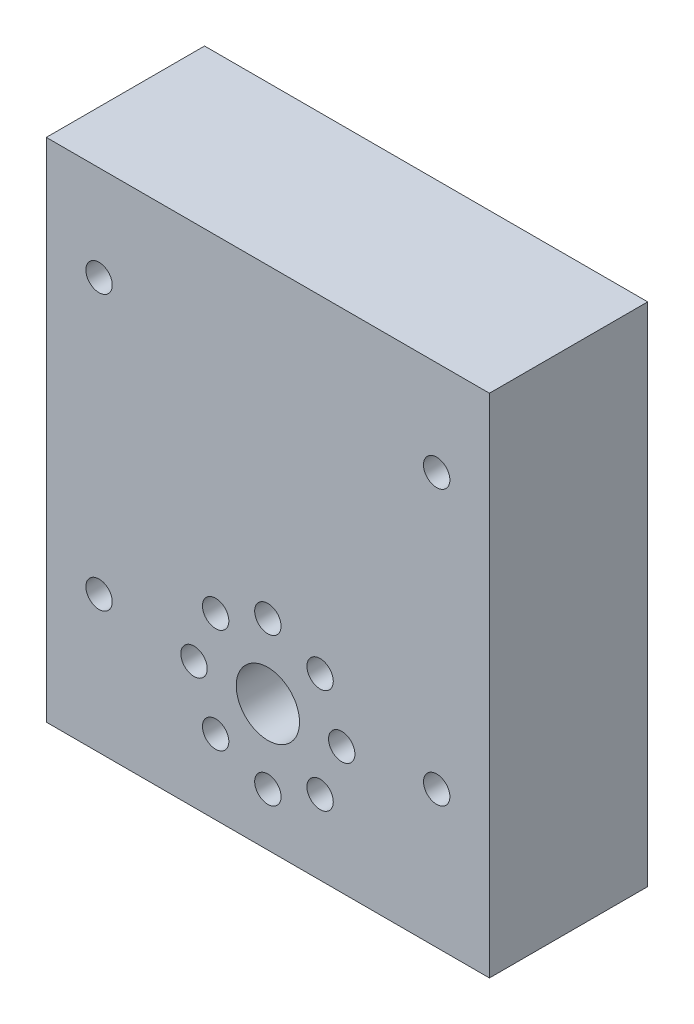
ISO-10303-21;
HEADER;
FILE_DESCRIPTION(('STEP AP214'),'2;1');
FILE_NAME('part.step','',(''),(''),'','','');
FILE_SCHEMA(('AUTOMOTIVE_DESIGN { 1 0 10303 214 1 1 1 1 }'));
ENDSEC;
DATA;
#1=APPLICATION_CONTEXT('core data for automotive mechanical design processes');
#2=APPLICATION_PROTOCOL_DEFINITION('international standard','automotive_design',2000,#1);
#3=PRODUCT_CONTEXT('',#1,'mechanical');
#4=PRODUCT('Part','Part','',(#3));
#5=PRODUCT_RELATED_PRODUCT_CATEGORY('part','',(#4));
#6=PRODUCT_DEFINITION_FORMATION('','',#4);
#7=PRODUCT_DEFINITION_CONTEXT('part definition',#1,'design');
#8=PRODUCT_DEFINITION('design','',#6,#7);
#9=PRODUCT_DEFINITION_SHAPE('','',#8);
#10=(LENGTH_UNIT() NAMED_UNIT(*) SI_UNIT(.MILLI.,.METRE.));
#11=(NAMED_UNIT(*) PLANE_ANGLE_UNIT() SI_UNIT($,.RADIAN.));
#12=(NAMED_UNIT(*) SI_UNIT($,.STERADIAN.) SOLID_ANGLE_UNIT());
#13=UNCERTAINTY_MEASURE_WITH_UNIT(LENGTH_MEASURE(1.E-05),#10,'distance_accuracy_value','');
#14=(GEOMETRIC_REPRESENTATION_CONTEXT(3) GLOBAL_UNCERTAINTY_ASSIGNED_CONTEXT((#13)) GLOBAL_UNIT_ASSIGNED_CONTEXT((#10,
#11,#12)) REPRESENTATION_CONTEXT('',''));
#15=CARTESIAN_POINT('',(0.,0.,0.));
#16=DIRECTION('',(0.,0.,1.));
#17=DIRECTION('',(1.,0.,0.));
#18=AXIS2_PLACEMENT_3D('',#15,#16,#17);
#19=CARTESIAN_POINT('',(0.,0.,15.));
#20=DIRECTION('',(0.,0.,1.));
#21=DIRECTION('',(1.,0.,0.));
#22=AXIS2_PLACEMENT_3D('',#19,#20,#21);
#23=PLANE('',#22);
#24=CARTESIAN_POINT('',(-15.8639914703956,-16.0706505239017,15.));
#25=DIRECTION('',(0.,0.,1.));
#26=DIRECTION('',(1.,0.,0.));
#27=AXIS2_PLACEMENT_3D('',#24,#25,#26);
#28=CIRCLE('',#27,1.25);
#29=CARTESIAN_POINT('',(-14.6139914703956,-16.0706505239017,15.));
#30=VERTEX_POINT('',#29);
#31=EDGE_CURVE('E366',#30,#30,#28,.T.);
#32=ORIENTED_EDGE('',*,*,#31,.F.);
#33=EDGE_LOOP('',(#32));
#34=FACE_BOUND('',#33,.T.);
#35=CARTESIAN_POINT('',(-13.8137389387014,-21.0203979922075,15.));
#36=DIRECTION('',(0.,0.,1.));
#37=DIRECTION('',(1.,0.,0.));
#38=AXIS2_PLACEMENT_3D('',#35,#36,#37);
#39=CIRCLE('',#38,1.25);
#40=CARTESIAN_POINT('',(-12.5637389387014,-21.0203979922075,15.));
#41=VERTEX_POINT('',#40);
#42=EDGE_CURVE('E367',#41,#41,#39,.T.);
#43=ORIENTED_EDGE('',*,*,#42,.F.);
#44=EDGE_LOOP('',(#43));
#45=FACE_BOUND('',#44,.T.);
#46=CARTESIAN_POINT('',(-15.8639914703955,-25.9701454605134,15.));
#47=DIRECTION('',(0.,0.,1.));
#48=DIRECTION('',(1.,0.,0.));
#49=AXIS2_PLACEMENT_3D('',#46,#47,#48);
#50=CIRCLE('',#49,1.25);
#51=CARTESIAN_POINT('',(-14.6139914703955,-25.9701454605134,15.));
#52=VERTEX_POINT('',#51);
#53=EDGE_CURVE('E370',#52,#52,#50,.T.);
#54=ORIENTED_EDGE('',*,*,#53,.F.);
#55=EDGE_LOOP('',(#54));
#56=FACE_BOUND('',#55,.T.);
#57=CARTESIAN_POINT('',(-20.8137389387013,-28.0203979922076,15.));
#58=DIRECTION('',(0.,0.,1.));
#59=DIRECTION('',(1.,0.,0.));
#60=AXIS2_PLACEMENT_3D('',#57,#58,#59);
#61=CIRCLE('',#60,1.25);
#62=CARTESIAN_POINT('',(-19.5637389387013,-28.0203979922076,15.));
#63=VERTEX_POINT('',#62);
#64=EDGE_CURVE('E382',#63,#63,#61,.T.);
#65=ORIENTED_EDGE('',*,*,#64,.F.);
#66=EDGE_LOOP('',(#65));
#67=FACE_BOUND('',#66,.T.);
#68=CARTESIAN_POINT('',(-25.7634864070072,-25.9701454605135,15.));
#69=DIRECTION('',(0.,0.,1.));
#70=DIRECTION('',(1.,0.,0.));
#71=AXIS2_PLACEMENT_3D('',#68,#69,#70);
#72=CIRCLE('',#71,1.25);
#73=CARTESIAN_POINT('',(-24.5134864070072,-25.9701454605135,15.));
#74=VERTEX_POINT('',#73);
#75=EDGE_CURVE('E144',#74,#74,#72,.T.);
#76=ORIENTED_EDGE('',*,*,#75,.F.);
#77=EDGE_LOOP('',(#76));
#78=FACE_BOUND('',#77,.T.);
#79=CARTESIAN_POINT('',(-27.8137389387014,-21.0203979922077,15.));
#80=DIRECTION('',(0.,0.,1.));
#81=DIRECTION('',(1.,0.,0.));
#82=AXIS2_PLACEMENT_3D('',#79,#80,#81);
#83=CIRCLE('',#82,1.25);
#84=CARTESIAN_POINT('',(-26.5637389387014,-21.0203979922077,15.));
#85=VERTEX_POINT('',#84);
#86=EDGE_CURVE('E378',#85,#85,#83,.T.);
#87=ORIENTED_EDGE('',*,*,#86,.F.);
#88=EDGE_LOOP('',(#87));
#89=FACE_BOUND('',#88,.T.);
#90=CARTESIAN_POINT('',(-25.7634864070073,-16.0706505239019,15.));
#91=DIRECTION('',(0.,0.,1.));
#92=DIRECTION('',(1.,0.,0.));
#93=AXIS2_PLACEMENT_3D('',#90,#91,#92);
#94=CIRCLE('',#93,1.25);
#95=CARTESIAN_POINT('',(-24.5134864070073,-16.0706505239019,15.));
#96=VERTEX_POINT('',#95);
#97=EDGE_CURVE('E376',#96,#96,#94,.T.);
#98=ORIENTED_EDGE('',*,*,#97,.F.);
#99=EDGE_LOOP('',(#98));
#100=FACE_BOUND('',#99,.T.);
#101=CARTESIAN_POINT('',(-20.8137389387015,-14.0203979922076,15.));
#102=DIRECTION('',(0.,0.,1.));
#103=DIRECTION('',(1.,0.,0.));
#104=AXIS2_PLACEMENT_3D('',#101,#102,#103);
#105=CIRCLE('',#104,1.25);
#106=CARTESIAN_POINT('',(-19.5637389387015,-14.0203979922076,15.));
#107=VERTEX_POINT('',#106);
#108=EDGE_CURVE('E117',#107,#107,#105,.T.);
#109=ORIENTED_EDGE('',*,*,#108,.F.);
#110=EDGE_LOOP('',(#109));
#111=FACE_BOUND('',#110,.T.);
#112=CARTESIAN_POINT('',(-20.8137389387015,-21.0203979922076,15.));
#113=DIRECTION('',(0.,0.,1.));
#114=DIRECTION('',(1.,0.,0.));
#115=AXIS2_PLACEMENT_3D('',#112,#113,#114);
#116=CIRCLE('',#115,3.);
#117=CARTESIAN_POINT('',(-17.8137389387015,-21.0203979922076,15.));
#118=VERTEX_POINT('',#117);
#119=EDGE_CURVE('E112',#118,#118,#116,.T.);
#120=ORIENTED_EDGE('',*,*,#119,.F.);
#121=EDGE_LOOP('',(#120));
#122=FACE_BOUND('',#121,.T.);
#123=CARTESIAN_POINT('',(-4.81373893870148,-20.0203979922076,15.));
#124=DIRECTION('',(0.,0.,1.));
#125=DIRECTION('',(1.,0.,0.));
#126=AXIS2_PLACEMENT_3D('',#123,#124,#125);
#127=CIRCLE('',#126,1.25);
#128=CARTESIAN_POINT('',(-3.56373893870148,-20.0203979922076,15.));
#129=VERTEX_POINT('',#128);
#130=EDGE_CURVE('E152',#129,#129,#127,.T.);
#131=ORIENTED_EDGE('',*,*,#130,.F.);
#132=EDGE_LOOP('',(#131));
#133=FACE_BOUND('',#132,.T.);
#134=CARTESIAN_POINT('',(-36.8137389387015,5.97960200779237,15.));
#135=DIRECTION('',(0.,0.,1.));
#136=DIRECTION('',(1.,0.,0.));
#137=AXIS2_PLACEMENT_3D('',#134,#135,#136);
#138=CIRCLE('',#137,1.25);
#139=CARTESIAN_POINT('',(-35.5637389387015,5.97960200779237,15.));
#140=VERTEX_POINT('',#139);
#141=EDGE_CURVE('E102',#140,#140,#138,.T.);
#142=ORIENTED_EDGE('',*,*,#141,.F.);
#143=EDGE_LOOP('',(#142));
#144=FACE_BOUND('',#143,.T.);
#145=DIRECTION('',(0.,-1.,0.));
#146=VECTOR('',#145,1.);
#147=CARTESIAN_POINT('',(-41.8137389387015,14.9796020077924,15.));
#148=LINE('',#147,#146);
#149=CARTESIAN_POINT('',(-41.8137389387015,14.9796020077924,15.));
#150=VERTEX_POINT('',#149);
#151=CARTESIAN_POINT('',(-41.8137389387015,-33.0203979922076,15.));
#152=VERTEX_POINT('',#151);
#153=EDGE_CURVE('E86',#150,#152,#148,.T.);
#154=ORIENTED_EDGE('',*,*,#153,.T.);
#155=DIRECTION('',(1.,0.,0.));
#156=VECTOR('',#155,1.);
#157=CARTESIAN_POINT('',(-41.8137389387015,-33.0203979922076,15.));
#158=LINE('',#157,#156);
#159=CARTESIAN_POINT('',(0.186261061298519,-33.0203979922076,15.));
#160=VERTEX_POINT('',#159);
#161=EDGE_CURVE('E81',#152,#160,#158,.T.);
#162=ORIENTED_EDGE('',*,*,#161,.T.);
#163=DIRECTION('',(0.,1.,0.));
#164=VECTOR('',#163,1.);
#165=CARTESIAN_POINT('',(0.186261061298515,14.9796020077924,15.));
#166=LINE('',#165,#164);
#167=CARTESIAN_POINT('',(0.186261061298515,14.9796020077924,15.));
#168=VERTEX_POINT('',#167);
#169=EDGE_CURVE('E84',#160,#168,#166,.T.);
#170=ORIENTED_EDGE('',*,*,#169,.T.);
#171=DIRECTION('',(-1.,0.,0.));
#172=VECTOR('',#171,1.);
#173=CARTESIAN_POINT('',(-41.8137389387015,14.9796020077924,15.));
#174=LINE('',#173,#172);
#175=EDGE_CURVE('E51',#168,#150,#174,.T.);
#176=ORIENTED_EDGE('',*,*,#175,.T.);
#177=EDGE_LOOP('',(#154,#162,#170,#176));
#178=FACE_BOUND('',#177,.T.);
#179=CARTESIAN_POINT('',(-36.8137389387015,-20.0203979922076,15.));
#180=DIRECTION('',(0.,0.,1.));
#181=DIRECTION('',(1.,0.,0.));
#182=AXIS2_PLACEMENT_3D('',#179,#180,#181);
#183=CIRCLE('',#182,1.25);
#184=CARTESIAN_POINT('',(-35.5637389387015,-20.0203979922076,15.));
#185=VERTEX_POINT('',#184);
#186=EDGE_CURVE('E158',#185,#185,#183,.T.);
#187=ORIENTED_EDGE('',*,*,#186,.F.);
#188=EDGE_LOOP('',(#187));
#189=FACE_BOUND('',#188,.T.);
#190=CARTESIAN_POINT('',(-4.81373893870149,5.97960200779237,15.));
#191=DIRECTION('',(0.,0.,1.));
#192=DIRECTION('',(1.,0.,0.));
#193=AXIS2_PLACEMENT_3D('',#190,#191,#192);
#194=CIRCLE('',#193,1.25);
#195=CARTESIAN_POINT('',(-3.56373893870149,5.97960200779237,15.));
#196=VERTEX_POINT('',#195);
#197=EDGE_CURVE('E146',#196,#196,#194,.T.);
#198=ORIENTED_EDGE('',*,*,#197,.F.);
#199=EDGE_LOOP('',(#198));
#200=FACE_BOUND('',#199,.T.);
#201=ADVANCED_FACE('F32',(#34,#45,#56,#67,#78,#89,#100,#111,#122,#133,#144,#178,#189,#200),#23,.T.);
#202=CARTESIAN_POINT('',(0.,0.,0.));
#203=DIRECTION('',(0.,0.,1.));
#204=DIRECTION('',(1.,0.,0.));
#205=AXIS2_PLACEMENT_3D('',#202,#203,#204);
#206=PLANE('',#205);
#207=CARTESIAN_POINT('',(-15.8639914703956,-16.0706505239017,0.));
#208=DIRECTION('',(0.,0.,1.));
#209=DIRECTION('',(1.,0.,0.));
#210=AXIS2_PLACEMENT_3D('',#207,#208,#209);
#211=CIRCLE('',#210,1.25);
#212=CARTESIAN_POINT('',(-14.6139914703956,-16.0706505239017,0.));
#213=VERTEX_POINT('',#212);
#214=EDGE_CURVE('E36',#213,#213,#211,.T.);
#215=ORIENTED_EDGE('',*,*,#214,.T.);
#216=EDGE_LOOP('',(#215));
#217=FACE_BOUND('',#216,.T.);
#218=CARTESIAN_POINT('',(-13.8137389387014,-21.0203979922075,0.));
#219=DIRECTION('',(0.,0.,1.));
#220=DIRECTION('',(1.,0.,0.));
#221=AXIS2_PLACEMENT_3D('',#218,#219,#220);
#222=CIRCLE('',#221,1.25);
#223=CARTESIAN_POINT('',(-12.5637389387014,-21.0203979922075,0.));
#224=VERTEX_POINT('',#223);
#225=EDGE_CURVE('E131',#224,#224,#222,.T.);
#226=ORIENTED_EDGE('',*,*,#225,.T.);
#227=EDGE_LOOP('',(#226));
#228=FACE_BOUND('',#227,.T.);
#229=CARTESIAN_POINT('',(-15.8639914703955,-25.9701454605134,0.));
#230=DIRECTION('',(0.,0.,1.));
#231=DIRECTION('',(1.,0.,0.));
#232=AXIS2_PLACEMENT_3D('',#229,#230,#231);
#233=CIRCLE('',#232,1.25);
#234=CARTESIAN_POINT('',(-14.6139914703955,-25.9701454605134,0.));
#235=VERTEX_POINT('',#234);
#236=EDGE_CURVE('E129',#235,#235,#233,.T.);
#237=ORIENTED_EDGE('',*,*,#236,.T.);
#238=EDGE_LOOP('',(#237));
#239=FACE_BOUND('',#238,.T.);
#240=CARTESIAN_POINT('',(-20.8137389387013,-28.0203979922076,0.));
#241=DIRECTION('',(0.,0.,1.));
#242=DIRECTION('',(1.,0.,0.));
#243=AXIS2_PLACEMENT_3D('',#240,#241,#242);
#244=CIRCLE('',#243,1.25);
#245=CARTESIAN_POINT('',(-19.5637389387013,-28.0203979922076,0.));
#246=VERTEX_POINT('',#245);
#247=EDGE_CURVE('E126',#246,#246,#244,.T.);
#248=ORIENTED_EDGE('',*,*,#247,.T.);
#249=EDGE_LOOP('',(#248));
#250=FACE_BOUND('',#249,.T.);
#251=CARTESIAN_POINT('',(-25.7634864070072,-25.9701454605135,0.));
#252=DIRECTION('',(0.,0.,1.));
#253=DIRECTION('',(1.,0.,0.));
#254=AXIS2_PLACEMENT_3D('',#251,#252,#253);
#255=CIRCLE('',#254,1.25);
#256=CARTESIAN_POINT('',(-24.5134864070072,-25.9701454605135,0.));
#257=VERTEX_POINT('',#256);
#258=EDGE_CURVE('E123',#257,#257,#255,.T.);
#259=ORIENTED_EDGE('',*,*,#258,.T.);
#260=EDGE_LOOP('',(#259));
#261=FACE_BOUND('',#260,.T.);
#262=CARTESIAN_POINT('',(-27.8137389387014,-21.0203979922077,0.));
#263=DIRECTION('',(0.,0.,1.));
#264=DIRECTION('',(1.,0.,0.));
#265=AXIS2_PLACEMENT_3D('',#262,#263,#264);
#266=CIRCLE('',#265,1.25);
#267=CARTESIAN_POINT('',(-26.5637389387014,-21.0203979922077,0.));
#268=VERTEX_POINT('',#267);
#269=EDGE_CURVE('E120',#268,#268,#266,.T.);
#270=ORIENTED_EDGE('',*,*,#269,.T.);
#271=EDGE_LOOP('',(#270));
#272=FACE_BOUND('',#271,.T.);
#273=CARTESIAN_POINT('',(-25.7634864070073,-16.0706505239019,0.));
#274=DIRECTION('',(0.,0.,1.));
#275=DIRECTION('',(1.,0.,0.));
#276=AXIS2_PLACEMENT_3D('',#273,#274,#275);
#277=CIRCLE('',#276,1.25);
#278=CARTESIAN_POINT('',(-24.5134864070073,-16.0706505239019,0.));
#279=VERTEX_POINT('',#278);
#280=EDGE_CURVE('E116',#279,#279,#277,.T.);
#281=ORIENTED_EDGE('',*,*,#280,.T.);
#282=EDGE_LOOP('',(#281));
#283=FACE_BOUND('',#282,.T.);
#284=CARTESIAN_POINT('',(-20.8137389387015,-14.0203979922076,0.));
#285=DIRECTION('',(0.,0.,1.));
#286=DIRECTION('',(1.,0.,0.));
#287=AXIS2_PLACEMENT_3D('',#284,#285,#286);
#288=CIRCLE('',#287,1.25);
#289=CARTESIAN_POINT('',(-19.5637389387015,-14.0203979922076,0.));
#290=VERTEX_POINT('',#289);
#291=EDGE_CURVE('E113',#290,#290,#288,.T.);
#292=ORIENTED_EDGE('',*,*,#291,.T.);
#293=EDGE_LOOP('',(#292));
#294=FACE_BOUND('',#293,.T.);
#295=CARTESIAN_POINT('',(-20.8137389387015,-21.0203979922076,0.));
#296=DIRECTION('',(0.,0.,1.));
#297=DIRECTION('',(1.,0.,0.));
#298=AXIS2_PLACEMENT_3D('',#295,#296,#297);
#299=CIRCLE('',#298,3.);
#300=CARTESIAN_POINT('',(-17.8137389387015,-21.0203979922076,0.));
#301=VERTEX_POINT('',#300);
#302=EDGE_CURVE('E108',#301,#301,#299,.T.);
#303=ORIENTED_EDGE('',*,*,#302,.T.);
#304=EDGE_LOOP('',(#303));
#305=FACE_BOUND('',#304,.T.);
#306=DIRECTION('',(0.,-1.,0.));
#307=VECTOR('',#306,1.);
#308=CARTESIAN_POINT('',(-41.8137389387015,14.9796020077924,0.));
#309=LINE('',#308,#307);
#310=CARTESIAN_POINT('',(-41.8137389387015,14.9796020077924,0.));
#311=VERTEX_POINT('',#310);
#312=CARTESIAN_POINT('',(-41.8137389387015,-33.0203979922076,0.));
#313=VERTEX_POINT('',#312);
#314=EDGE_CURVE('E99',#311,#313,#309,.T.);
#315=ORIENTED_EDGE('',*,*,#314,.F.);
#316=DIRECTION('',(-1.,0.,0.));
#317=VECTOR('',#316,1.);
#318=CARTESIAN_POINT('',(-41.8137389387015,14.9796020077924,0.));
#319=LINE('',#318,#317);
#320=CARTESIAN_POINT('',(0.186261061298515,14.9796020077924,0.));
#321=VERTEX_POINT('',#320);
#322=EDGE_CURVE('E74',#321,#311,#319,.T.);
#323=ORIENTED_EDGE('',*,*,#322,.F.);
#324=DIRECTION('',(0.,1.,0.));
#325=VECTOR('',#324,1.);
#326=CARTESIAN_POINT('',(0.186261061298515,14.9796020077924,0.));
#327=LINE('',#326,#325);
#328=CARTESIAN_POINT('',(0.186261061298519,-33.0203979922076,0.));
#329=VERTEX_POINT('',#328);
#330=EDGE_CURVE('E68',#329,#321,#327,.T.);
#331=ORIENTED_EDGE('',*,*,#330,.F.);
#332=DIRECTION('',(1.,0.,0.));
#333=VECTOR('',#332,1.);
#334=CARTESIAN_POINT('',(-41.8137389387015,-33.0203979922076,0.));
#335=LINE('',#334,#333);
#336=EDGE_CURVE('E90',#313,#329,#335,.T.);
#337=ORIENTED_EDGE('',*,*,#336,.F.);
#338=EDGE_LOOP('',(#315,#323,#331,#337));
#339=FACE_BOUND('',#338,.T.);
#340=CARTESIAN_POINT('',(-36.8137389387015,5.97960200779237,0.));
#341=DIRECTION('',(0.,0.,1.));
#342=DIRECTION('',(1.,0.,0.));
#343=AXIS2_PLACEMENT_3D('',#340,#341,#342);
#344=CIRCLE('',#343,1.25);
#345=CARTESIAN_POINT('',(-35.5637389387015,5.97960200779237,0.));
#346=VERTEX_POINT('',#345);
#347=EDGE_CURVE('E161',#346,#346,#344,.T.);
#348=ORIENTED_EDGE('',*,*,#347,.T.);
#349=EDGE_LOOP('',(#348));
#350=FACE_BOUND('',#349,.T.);
#351=CARTESIAN_POINT('',(-36.8137389387015,-20.0203979922076,0.));
#352=DIRECTION('',(0.,0.,1.));
#353=DIRECTION('',(1.,0.,0.));
#354=AXIS2_PLACEMENT_3D('',#351,#352,#353);
#355=CIRCLE('',#354,1.25);
#356=CARTESIAN_POINT('',(-35.5637389387015,-20.0203979922076,0.));
#357=VERTEX_POINT('',#356);
#358=EDGE_CURVE('E155',#357,#357,#355,.T.);
#359=ORIENTED_EDGE('',*,*,#358,.T.);
#360=EDGE_LOOP('',(#359));
#361=FACE_BOUND('',#360,.T.);
#362=CARTESIAN_POINT('',(-4.81373893870148,-20.0203979922076,0.));
#363=DIRECTION('',(0.,0.,1.));
#364=DIRECTION('',(1.,0.,0.));
#365=AXIS2_PLACEMENT_3D('',#362,#363,#364);
#366=CIRCLE('',#365,1.25);
#367=CARTESIAN_POINT('',(-3.56373893870148,-20.0203979922076,0.));
#368=VERTEX_POINT('',#367);
#369=EDGE_CURVE('E149',#368,#368,#366,.T.);
#370=ORIENTED_EDGE('',*,*,#369,.T.);
#371=EDGE_LOOP('',(#370));
#372=FACE_BOUND('',#371,.T.);
#373=CARTESIAN_POINT('',(-4.81373893870149,5.97960200779237,0.));
#374=DIRECTION('',(0.,0.,1.));
#375=DIRECTION('',(1.,0.,0.));
#376=AXIS2_PLACEMENT_3D('',#373,#374,#375);
#377=CIRCLE('',#376,1.25);
#378=CARTESIAN_POINT('',(-3.56373893870149,5.97960200779237,0.));
#379=VERTEX_POINT('',#378);
#380=EDGE_CURVE('E111',#379,#379,#377,.T.);
#381=ORIENTED_EDGE('',*,*,#380,.T.);
#382=EDGE_LOOP('',(#381));
#383=FACE_BOUND('',#382,.T.);
#384=ADVANCED_FACE('F169',(#217,#228,#239,#250,#261,#272,#283,#294,#305,#339,#350,#361,#372,
#383),#206,.F.);
#385=CARTESIAN_POINT('',(-41.8137389387015,14.9796020077924,15.));
#386=DIRECTION('',(1.,0.,0.));
#387=DIRECTION('',(0.,1.,0.));
#388=AXIS2_PLACEMENT_3D('',#385,#386,#387);
#389=PLANE('',#388);
#390=ORIENTED_EDGE('',*,*,#314,.T.);
#391=DIRECTION('',(0.,0.,-1.));
#392=VECTOR('',#391,1.);
#393=CARTESIAN_POINT('',(-41.8137389387015,-33.0203979922076,15.));
#394=LINE('',#393,#392);
#395=EDGE_CURVE('E11',#152,#313,#394,.T.);
#396=ORIENTED_EDGE('',*,*,#395,.F.);
#397=ORIENTED_EDGE('',*,*,#153,.F.);
#398=DIRECTION('',(0.,0.,-1.));
#399=VECTOR('',#398,1.);
#400=CARTESIAN_POINT('',(-41.8137389387015,14.9796020077924,15.));
#401=LINE('',#400,#399);
#402=EDGE_CURVE('E95',#150,#311,#401,.T.);
#403=ORIENTED_EDGE('',*,*,#402,.T.);
#404=EDGE_LOOP('',(#390,#396,#397,#403));
#405=FACE_BOUND('',#404,.T.);
#406=ADVANCED_FACE('F34',(#405),#389,.F.);
#407=CARTESIAN_POINT('',(-41.8137389387015,-33.0203979922076,15.));
#408=DIRECTION('',(0.,1.,0.));
#409=DIRECTION('',(0.,0.,1.));
#410=AXIS2_PLACEMENT_3D('',#407,#408,#409);
#411=PLANE('',#410);
#412=ORIENTED_EDGE('',*,*,#336,.T.);
#413=DIRECTION('',(0.,0.,-1.));
#414=VECTOR('',#413,1.);
#415=CARTESIAN_POINT('',(0.186261061298519,-33.0203979922076,15.));
#416=LINE('',#415,#414);
#417=EDGE_CURVE('E42',#160,#329,#416,.T.);
#418=ORIENTED_EDGE('',*,*,#417,.F.);
#419=ORIENTED_EDGE('',*,*,#161,.F.);
#420=ORIENTED_EDGE('',*,*,#395,.T.);
#421=EDGE_LOOP('',(#412,#418,#419,#420));
#422=FACE_BOUND('',#421,.T.);
#423=ADVANCED_FACE('F89',(#422),#411,.F.);
#424=CARTESIAN_POINT('',(0.186261061298515,14.9796020077924,15.));
#425=DIRECTION('',(-1.,0.,0.));
#426=DIRECTION('',(0.,-1.,0.));
#427=AXIS2_PLACEMENT_3D('',#424,#425,#426);
#428=PLANE('',#427);
#429=ORIENTED_EDGE('',*,*,#330,.T.);
#430=DIRECTION('',(0.,0.,-1.));
#431=VECTOR('',#430,1.);
#432=CARTESIAN_POINT('',(0.186261061298515,14.9796020077924,15.));
#433=LINE('',#432,#431);
#434=EDGE_CURVE('E91',#168,#321,#433,.T.);
#435=ORIENTED_EDGE('',*,*,#434,.F.);
#436=ORIENTED_EDGE('',*,*,#169,.F.);
#437=ORIENTED_EDGE('',*,*,#417,.T.);
#438=EDGE_LOOP('',(#429,#435,#436,#437));
#439=FACE_BOUND('',#438,.T.);
#440=ADVANCED_FACE('F93',(#439),#428,.F.);
#441=CARTESIAN_POINT('',(-41.8137389387015,14.9796020077924,15.));
#442=DIRECTION('',(0.,-1.,0.));
#443=DIRECTION('',(0.,0.,-1.));
#444=AXIS2_PLACEMENT_3D('',#441,#442,#443);
#445=PLANE('',#444);
#446=ORIENTED_EDGE('',*,*,#322,.T.);
#447=ORIENTED_EDGE('',*,*,#402,.F.);
#448=ORIENTED_EDGE('',*,*,#175,.F.);
#449=ORIENTED_EDGE('',*,*,#434,.T.);
#450=EDGE_LOOP('',(#446,#447,#448,#449));
#451=FACE_BOUND('',#450,.T.);
#452=ADVANCED_FACE('F175',(#451),#445,.F.);
#453=CARTESIAN_POINT('',(-36.8137389387015,5.97960200779237,15.));
#454=DIRECTION('',(0.,0.,-1.));
#455=DIRECTION('',(-1.,0.,0.));
#456=AXIS2_PLACEMENT_3D('',#453,#454,#455);
#457=CYLINDRICAL_SURFACE('',#456,1.25);
#458=ORIENTED_EDGE('',*,*,#141,.T.);
#459=EDGE_LOOP('',(#458));
#460=FACE_BOUND('',#459,.T.);
#461=ORIENTED_EDGE('',*,*,#347,.F.);
#462=EDGE_LOOP('',(#461));
#463=FACE_BOUND('',#462,.T.);
#464=ADVANCED_FACE('F172',(#460,#463),#457,.F.);
#465=CARTESIAN_POINT('',(-36.8137389387015,-20.0203979922076,15.));
#466=DIRECTION('',(0.,0.,-1.));
#467=DIRECTION('',(-1.,0.,0.));
#468=AXIS2_PLACEMENT_3D('',#465,#466,#467);
#469=CYLINDRICAL_SURFACE('',#468,1.25);
#470=ORIENTED_EDGE('',*,*,#186,.T.);
#471=EDGE_LOOP('',(#470));
#472=FACE_BOUND('',#471,.T.);
#473=ORIENTED_EDGE('',*,*,#358,.F.);
#474=EDGE_LOOP('',(#473));
#475=FACE_BOUND('',#474,.T.);
#476=ADVANCED_FACE('F174',(#472,#475),#469,.F.);
#477=CARTESIAN_POINT('',(-4.81373893870148,-20.0203979922076,15.));
#478=DIRECTION('',(0.,0.,-1.));
#479=DIRECTION('',(-1.,0.,0.));
#480=AXIS2_PLACEMENT_3D('',#477,#478,#479);
#481=CYLINDRICAL_SURFACE('',#480,1.25);
#482=ORIENTED_EDGE('',*,*,#130,.T.);
#483=EDGE_LOOP('',(#482));
#484=FACE_BOUND('',#483,.T.);
#485=ORIENTED_EDGE('',*,*,#369,.F.);
#486=EDGE_LOOP('',(#485));
#487=FACE_BOUND('',#486,.T.);
#488=ADVANCED_FACE('F182',(#484,#487),#481,.F.);
#489=CARTESIAN_POINT('',(-4.81373893870149,5.97960200779237,15.));
#490=DIRECTION('',(0.,0.,-1.));
#491=DIRECTION('',(-1.,0.,0.));
#492=AXIS2_PLACEMENT_3D('',#489,#490,#491);
#493=CYLINDRICAL_SURFACE('',#492,1.25);
#494=ORIENTED_EDGE('',*,*,#197,.T.);
#495=EDGE_LOOP('',(#494));
#496=FACE_BOUND('',#495,.T.);
#497=ORIENTED_EDGE('',*,*,#380,.F.);
#498=EDGE_LOOP('',(#497));
#499=FACE_BOUND('',#498,.T.);
#500=ADVANCED_FACE('F224',(#496,#499),#493,.F.);
#501=CARTESIAN_POINT('',(-20.8137389387015,-21.0203979922076,-5.));
#502=DIRECTION('',(0.,0.,1.));
#503=DIRECTION('',(1.,0.,0.));
#504=AXIS2_PLACEMENT_3D('',#501,#502,#503);
#505=CYLINDRICAL_SURFACE('',#504,3.);
#506=ORIENTED_EDGE('',*,*,#119,.T.);
#507=EDGE_LOOP('',(#506));
#508=FACE_BOUND('',#507,.T.);
#509=ORIENTED_EDGE('',*,*,#302,.F.);
#510=EDGE_LOOP('',(#509));
#511=FACE_BOUND('',#510,.T.);
#512=ADVANCED_FACE('F218',(#508,#511),#505,.F.);
#513=CARTESIAN_POINT('',(-20.8137389387015,-14.0203979922076,-5.));
#514=DIRECTION('',(0.,0.,1.));
#515=DIRECTION('',(1.,0.,0.));
#516=AXIS2_PLACEMENT_3D('',#513,#514,#515);
#517=CYLINDRICAL_SURFACE('',#516,1.25);
#518=ORIENTED_EDGE('',*,*,#108,.T.);
#519=EDGE_LOOP('',(#518));
#520=FACE_BOUND('',#519,.T.);
#521=ORIENTED_EDGE('',*,*,#291,.F.);
#522=EDGE_LOOP('',(#521));
#523=FACE_BOUND('',#522,.T.);
#524=ADVANCED_FACE('F223',(#520,#523),#517,.F.);
#525=CARTESIAN_POINT('',(-25.7634864070073,-16.0706505239019,-5.));
#526=DIRECTION('',(0.,0.,1.));
#527=DIRECTION('',(1.,0.,0.));
#528=AXIS2_PLACEMENT_3D('',#525,#526,#527);
#529=CYLINDRICAL_SURFACE('',#528,1.25);
#530=ORIENTED_EDGE('',*,*,#97,.T.);
#531=EDGE_LOOP('',(#530));
#532=FACE_BOUND('',#531,.T.);
#533=ORIENTED_EDGE('',*,*,#280,.F.);
#534=EDGE_LOOP('',(#533));
#535=FACE_BOUND('',#534,.T.);
#536=ADVANCED_FACE('F235',(#532,#535),#529,.F.);
#537=CARTESIAN_POINT('',(-27.8137389387014,-21.0203979922077,-5.));
#538=DIRECTION('',(0.,0.,1.));
#539=DIRECTION('',(1.,0.,0.));
#540=AXIS2_PLACEMENT_3D('',#537,#538,#539);
#541=CYLINDRICAL_SURFACE('',#540,1.25);
#542=ORIENTED_EDGE('',*,*,#86,.T.);
#543=EDGE_LOOP('',(#542));
#544=FACE_BOUND('',#543,.T.);
#545=ORIENTED_EDGE('',*,*,#269,.F.);
#546=EDGE_LOOP('',(#545));
#547=FACE_BOUND('',#546,.T.);
#548=ADVANCED_FACE('F245',(#544,#547),#541,.F.);
#549=CARTESIAN_POINT('',(-25.7634864070072,-25.9701454605135,-5.));
#550=DIRECTION('',(0.,0.,1.));
#551=DIRECTION('',(1.,0.,0.));
#552=AXIS2_PLACEMENT_3D('',#549,#550,#551);
#553=CYLINDRICAL_SURFACE('',#552,1.25);
#554=ORIENTED_EDGE('',*,*,#75,.T.);
#555=EDGE_LOOP('',(#554));
#556=FACE_BOUND('',#555,.T.);
#557=ORIENTED_EDGE('',*,*,#258,.F.);
#558=EDGE_LOOP('',(#557));
#559=FACE_BOUND('',#558,.T.);
#560=ADVANCED_FACE('F255',(#556,#559),#553,.F.);
#561=CARTESIAN_POINT('',(-20.8137389387013,-28.0203979922076,-5.));
#562=DIRECTION('',(0.,0.,1.));
#563=DIRECTION('',(1.,0.,0.));
#564=AXIS2_PLACEMENT_3D('',#561,#562,#563);
#565=CYLINDRICAL_SURFACE('',#564,1.25);
#566=ORIENTED_EDGE('',*,*,#64,.T.);
#567=EDGE_LOOP('',(#566));
#568=FACE_BOUND('',#567,.T.);
#569=ORIENTED_EDGE('',*,*,#247,.F.);
#570=EDGE_LOOP('',(#569));
#571=FACE_BOUND('',#570,.T.);
#572=ADVANCED_FACE('F265',(#568,#571),#565,.F.);
#573=CARTESIAN_POINT('',(-15.8639914703955,-25.9701454605134,-5.));
#574=DIRECTION('',(0.,0.,1.));
#575=DIRECTION('',(1.,0.,0.));
#576=AXIS2_PLACEMENT_3D('',#573,#574,#575);
#577=CYLINDRICAL_SURFACE('',#576,1.25);
#578=ORIENTED_EDGE('',*,*,#53,.T.);
#579=EDGE_LOOP('',(#578));
#580=FACE_BOUND('',#579,.T.);
#581=ORIENTED_EDGE('',*,*,#236,.F.);
#582=EDGE_LOOP('',(#581));
#583=FACE_BOUND('',#582,.T.);
#584=ADVANCED_FACE('F275',(#580,#583),#577,.F.);
#585=CARTESIAN_POINT('',(-13.8137389387014,-21.0203979922075,-5.));
#586=DIRECTION('',(0.,0.,1.));
#587=DIRECTION('',(1.,0.,0.));
#588=AXIS2_PLACEMENT_3D('',#585,#586,#587);
#589=CYLINDRICAL_SURFACE('',#588,1.25);
#590=ORIENTED_EDGE('',*,*,#42,.T.);
#591=EDGE_LOOP('',(#590));
#592=FACE_BOUND('',#591,.T.);
#593=ORIENTED_EDGE('',*,*,#225,.F.);
#594=EDGE_LOOP('',(#593));
#595=FACE_BOUND('',#594,.T.);
#596=ADVANCED_FACE('F285',(#592,#595),#589,.F.);
#597=CARTESIAN_POINT('',(-15.8639914703956,-16.0706505239017,-5.));
#598=DIRECTION('',(0.,0.,1.));
#599=DIRECTION('',(1.,0.,0.));
#600=AXIS2_PLACEMENT_3D('',#597,#598,#599);
#601=CYLINDRICAL_SURFACE('',#600,1.25);
#602=ORIENTED_EDGE('',*,*,#31,.T.);
#603=EDGE_LOOP('',(#602));
#604=FACE_BOUND('',#603,.T.);
#605=ORIENTED_EDGE('',*,*,#214,.F.);
#606=EDGE_LOOP('',(#605));
#607=FACE_BOUND('',#606,.T.);
#608=ADVANCED_FACE('F295',(#604,#607),#601,.F.);
#609=CLOSED_SHELL('',(#201,#384,#406,#423,#440,#452,#464,#476,#488,#500,#512,#524,#536,#548,
#560,#572,#584,#596,#608));
#610=MANIFOLD_SOLID_BREP('B2',#609);
#611=ADVANCED_BREP_SHAPE_REPRESENTATION('',(#18,#610),#14);
#612=SHAPE_DEFINITION_REPRESENTATION(#9,#611);
ENDSEC;
END-ISO-10303-21;
